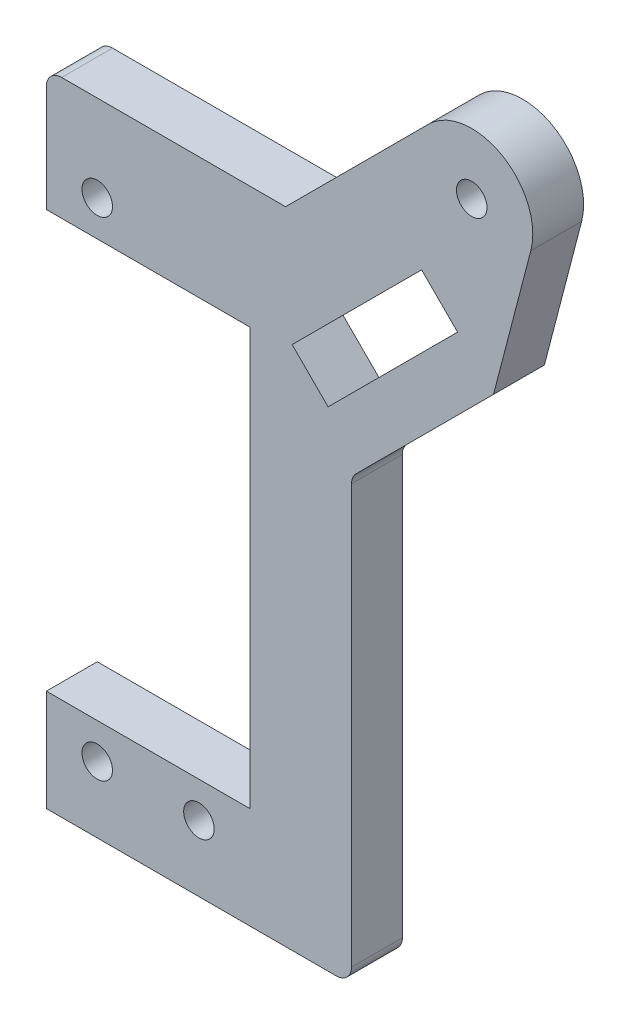
ISO-10303-21;
HEADER;
FILE_DESCRIPTION(('STEP AP214'),'2;1');
FILE_NAME('part.step','',(''),(''),'','','');
FILE_SCHEMA(('AUTOMOTIVE_DESIGN { 1 0 10303 214 1 1 1 1 }'));
ENDSEC;
DATA;
#1=APPLICATION_CONTEXT('core data for automotive mechanical design processes');
#2=APPLICATION_PROTOCOL_DEFINITION('international standard','automotive_design',2000,#1);
#3=PRODUCT_CONTEXT('',#1,'mechanical');
#4=PRODUCT('Part','Part','',(#3));
#5=PRODUCT_RELATED_PRODUCT_CATEGORY('part','',(#4));
#6=PRODUCT_DEFINITION_FORMATION('','',#4);
#7=PRODUCT_DEFINITION_CONTEXT('part definition',#1,'design');
#8=PRODUCT_DEFINITION('design','',#6,#7);
#9=PRODUCT_DEFINITION_SHAPE('','',#8);
#10=(LENGTH_UNIT() NAMED_UNIT(*) SI_UNIT(.MILLI.,.METRE.));
#11=(NAMED_UNIT(*) PLANE_ANGLE_UNIT() SI_UNIT($,.RADIAN.));
#12=(NAMED_UNIT(*) SI_UNIT($,.STERADIAN.) SOLID_ANGLE_UNIT());
#13=UNCERTAINTY_MEASURE_WITH_UNIT(LENGTH_MEASURE(1.E-05),#10,'distance_accuracy_value','');
#14=(GEOMETRIC_REPRESENTATION_CONTEXT(3) GLOBAL_UNCERTAINTY_ASSIGNED_CONTEXT((#13)) GLOBAL_UNIT_ASSIGNED_CONTEXT((#10,
#11,#12)) REPRESENTATION_CONTEXT('',''));
#15=CARTESIAN_POINT('',(0.,0.,0.));
#16=DIRECTION('',(0.,0.,1.));
#17=DIRECTION('',(1.,0.,0.));
#18=AXIS2_PLACEMENT_3D('',#15,#16,#17);
#19=CARTESIAN_POINT('',(-10.1762942811366,10.1762942811367,5.));
#20=DIRECTION('',(-0.707106781186545,0.70710678118655,0.));
#21=DIRECTION('',(-0.70710678118655,-0.707106781186545,0.));
#22=AXIS2_PLACEMENT_3D('',#19,#20,#21);
#23=PLANE('',#22);
#24=DIRECTION('',(0.70710678118655,0.707106781186545,0.));
#25=VECTOR('',#24,1.);
#26=CARTESIAN_POINT('',(-10.1762942811366,10.1762942811367,0.));
#27=LINE('',#26,#25);
#28=CARTESIAN_POINT('',(27.6980743896277,48.0506629519008,0.));
#29=VERTEX_POINT('',#28);
#30=CARTESIAN_POINT('',(40.4259964509856,60.7785850132586,0.));
#31=VERTEX_POINT('',#30);
#32=EDGE_CURVE('E274',#29,#31,#27,.T.);
#33=ORIENTED_EDGE('',*,*,#32,.F.);
#34=DIRECTION('',(0.,0.,-1.));
#35=VECTOR('',#34,1.);
#36=CARTESIAN_POINT('',(27.6980743896277,48.0506629519008,5.));
#37=LINE('',#36,#35);
#38=CARTESIAN_POINT('',(27.6980743896277,48.0506629519008,5.));
#39=VERTEX_POINT('',#38);
#40=EDGE_CURVE('E296',#39,#29,#37,.T.);
#41=ORIENTED_EDGE('',*,*,#40,.F.);
#42=DIRECTION('',(0.70710678118655,0.707106781186545,0.));
#43=VECTOR('',#42,1.);
#44=CARTESIAN_POINT('',(-10.1762942811366,10.1762942811367,5.));
#45=LINE('',#44,#43);
#46=CARTESIAN_POINT('',(40.4259964509856,60.7785850132586,5.));
#47=VERTEX_POINT('',#46);
#48=EDGE_CURVE('E221',#39,#47,#45,.T.);
#49=ORIENTED_EDGE('',*,*,#48,.T.);
#50=DIRECTION('',(0.,0.,-1.));
#51=VECTOR('',#50,1.);
#52=CARTESIAN_POINT('',(40.4259964509856,60.7785850132586,5.));
#53=LINE('',#52,#51);
#54=EDGE_CURVE('E177',#47,#31,#53,.T.);
#55=ORIENTED_EDGE('',*,*,#54,.T.);
#56=EDGE_LOOP('',(#33,#41,#49,#55));
#57=FACE_BOUND('',#56,.T.);
#58=ADVANCED_FACE('F35',(#57),#23,.T.);
#59=CARTESIAN_POINT('',(37.8743686707644,37.874368670764,5.));
#60=DIRECTION('',(0.707106781186551,0.707106781186544,0.));
#61=DIRECTION('',(-0.707106781186544,0.707106781186551,0.));
#62=AXIS2_PLACEMENT_3D('',#59,#60,#61);
#63=PLANE('',#62);
#64=DIRECTION('',(0.707106781186544,-0.707106781186551,0.));
#65=VECTOR('',#64,1.);
#66=CARTESIAN_POINT('',(37.8743686707644,37.874368670764,0.));
#67=LINE('',#66,#65);
#68=CARTESIAN_POINT('',(24.162540483695,51.5861968578336,0.));
#69=VERTEX_POINT('',#68);
#70=EDGE_CURVE('E277',#69,#29,#67,.T.);
#71=ORIENTED_EDGE('',*,*,#70,.F.);
#72=DIRECTION('',(0.,0.,-1.));
#73=VECTOR('',#72,1.);
#74=CARTESIAN_POINT('',(24.162540483695,51.5861968578336,5.));
#75=LINE('',#74,#73);
#76=CARTESIAN_POINT('',(24.162540483695,51.5861968578336,5.));
#77=VERTEX_POINT('',#76);
#78=EDGE_CURVE('E294',#77,#69,#75,.T.);
#79=ORIENTED_EDGE('',*,*,#78,.F.);
#80=DIRECTION('',(0.707106781186544,-0.707106781186551,0.));
#81=VECTOR('',#80,1.);
#82=CARTESIAN_POINT('',(37.8743686707644,37.874368670764,5.));
#83=LINE('',#82,#81);
#84=EDGE_CURVE('E224',#77,#39,#83,.T.);
#85=ORIENTED_EDGE('',*,*,#84,.T.);
#86=ORIENTED_EDGE('',*,*,#40,.T.);
#87=EDGE_LOOP('',(#71,#79,#85,#86));
#88=FACE_BOUND('',#87,.T.);
#89=ADVANCED_FACE('F397',(#88),#63,.T.);
#90=CARTESIAN_POINT('',(-13.7118281870694,13.7118281870695,5.));
#91=DIRECTION('',(0.707106781186545,-0.70710678118655,0.));
#92=DIRECTION('',(0.70710678118655,0.707106781186545,0.));
#93=AXIS2_PLACEMENT_3D('',#90,#91,#92);
#94=PLANE('',#93);
#95=DIRECTION('',(-0.70710678118655,-0.707106781186545,0.));
#96=VECTOR('',#95,1.);
#97=CARTESIAN_POINT('',(-13.7118281870694,13.7118281870695,0.));
#98=LINE('',#97,#96);
#99=CARTESIAN_POINT('',(36.8904625450529,64.3141189191914,0.));
#100=VERTEX_POINT('',#99);
#101=EDGE_CURVE('E280',#100,#69,#98,.T.);
#102=ORIENTED_EDGE('',*,*,#101,.F.);
#103=DIRECTION('',(0.,0.,-1.));
#104=VECTOR('',#103,1.);
#105=CARTESIAN_POINT('',(36.8904625450529,64.3141189191914,5.));
#106=LINE('',#105,#104);
#107=CARTESIAN_POINT('',(36.8904625450529,64.3141189191914,5.));
#108=VERTEX_POINT('',#107);
#109=EDGE_CURVE('E292',#108,#100,#106,.T.);
#110=ORIENTED_EDGE('',*,*,#109,.F.);
#111=DIRECTION('',(-0.70710678118655,-0.707106781186545,0.));
#112=VECTOR('',#111,1.);
#113=CARTESIAN_POINT('',(-13.7118281870694,13.7118281870695,5.));
#114=LINE('',#113,#112);
#115=EDGE_CURVE('E227',#108,#77,#114,.T.);
#116=ORIENTED_EDGE('',*,*,#115,.T.);
#117=ORIENTED_EDGE('',*,*,#78,.T.);
#118=EDGE_LOOP('',(#102,#110,#116,#117));
#119=FACE_BOUND('',#118,.T.);
#120=ADVANCED_FACE('F403',(#119),#94,.T.);
#121=CARTESIAN_POINT('',(41.8198051533549,72.8198051533756,5.));
#122=DIRECTION('',(0.,0.,-1.));
#123=DIRECTION('',(-1.,0.,0.));
#124=AXIS2_PLACEMENT_3D('',#121,#122,#123);
#125=CYLINDRICAL_SURFACE('',#124,5.99999999999999);
#126=CARTESIAN_POINT('',(41.8198051533549,72.8198051533756,0.));
#127=DIRECTION('',(0.,0.,1.));
#128=DIRECTION('',(1.,0.,0.));
#129=AXIS2_PLACEMENT_3D('',#126,#127,#128);
#130=CIRCLE('',#129,5.99999999999999);
#131=CARTESIAN_POINT('',(37.5771644662356,77.0624458404949,0.));
#132=VERTEX_POINT('',#131);
#133=CARTESIAN_POINT('',(47.625955008488,71.3069853162047,0.));
#134=VERTEX_POINT('',#133);
#135=EDGE_CURVE('E173',#132,#134,#130,.F.);
#136=ORIENTED_EDGE('',*,*,#135,.F.);
#137=DIRECTION('',(0.,0.,-1.));
#138=VECTOR('',#137,1.);
#139=CARTESIAN_POINT('',(37.5771644662356,77.0624458404949,5.));
#140=LINE('',#139,#138);
#141=CARTESIAN_POINT('',(37.5771644662356,77.0624458404949,5.));
#142=VERTEX_POINT('',#141);
#143=EDGE_CURVE('E166',#142,#132,#140,.T.);
#144=ORIENTED_EDGE('',*,*,#143,.F.);
#145=CARTESIAN_POINT('',(41.8198051533549,72.8198051533756,5.));
#146=DIRECTION('',(0.,0.,1.));
#147=DIRECTION('',(1.,0.,0.));
#148=AXIS2_PLACEMENT_3D('',#145,#146,#147);
#149=CIRCLE('',#148,5.99999999999999);
#150=CARTESIAN_POINT('',(47.625955008488,71.3069853162047,5.));
#151=VERTEX_POINT('',#150);
#152=EDGE_CURVE('E170',#142,#151,#149,.F.);
#153=ORIENTED_EDGE('',*,*,#152,.T.);
#154=DIRECTION('',(0.,0.,-1.));
#155=VECTOR('',#154,1.);
#156=CARTESIAN_POINT('',(47.625955008488,71.3069853162047,5.));
#157=LINE('',#156,#155);
#158=EDGE_CURVE('E241',#151,#134,#157,.T.);
#159=ORIENTED_EDGE('',*,*,#158,.T.);
#160=EDGE_LOOP('',(#136,#144,#153,#159));
#161=FACE_BOUND('',#160,.T.);
#162=ADVANCED_FACE('F168',(#161),#125,.T.);
#163=CARTESIAN_POINT('',(-19.7426406871298,19.7426406871299,5.));
#164=DIRECTION('',(0.707106781186545,-0.70710678118655,0.));
#165=DIRECTION('',(0.70710678118655,0.707106781186545,0.));
#166=AXIS2_PLACEMENT_3D('',#163,#164,#165);
#167=PLANE('',#166);
#168=DIRECTION('',(-0.70710678118655,-0.707106781186545,0.));
#169=VECTOR('',#168,1.);
#170=CARTESIAN_POINT('',(-19.7426406871298,19.7426406871299,0.));
#171=LINE('',#170,#169);
#172=CARTESIAN_POINT('',(23.5147186257407,63.,0.));
#173=VERTEX_POINT('',#172);
#174=EDGE_CURVE('E243',#132,#173,#171,.T.);
#175=ORIENTED_EDGE('',*,*,#174,.T.);
#176=DIRECTION('',(0.,0.,-1.));
#177=VECTOR('',#176,1.);
#178=CARTESIAN_POINT('',(23.5147186257407,63.,5.));
#179=LINE('',#178,#177);
#180=CARTESIAN_POINT('',(23.5147186257407,63.,5.));
#181=VERTEX_POINT('',#180);
#182=EDGE_CURVE('E178',#181,#173,#179,.T.);
#183=ORIENTED_EDGE('',*,*,#182,.F.);
#184=DIRECTION('',(-0.70710678118655,-0.707106781186545,0.));
#185=VECTOR('',#184,1.);
#186=CARTESIAN_POINT('',(-19.7426406871298,19.7426406871299,5.));
#187=LINE('',#186,#185);
#188=EDGE_CURVE('E182',#142,#181,#187,.T.);
#189=ORIENTED_EDGE('',*,*,#188,.F.);
#190=ORIENTED_EDGE('',*,*,#143,.T.);
#191=EDGE_LOOP('',(#175,#183,#189,#190));
#192=FACE_BOUND('',#191,.T.);
#193=ADVANCED_FACE('F183',(#192),#167,.F.);
#194=CARTESIAN_POINT('',(0.,63.,5.));
#195=DIRECTION('',(0.,1.,0.));
#196=DIRECTION('',(-1.,0.,0.));
#197=AXIS2_PLACEMENT_3D('',#194,#195,#196);
#198=PLANE('',#197);
#199=DIRECTION('',(1.,0.,0.));
#200=VECTOR('',#199,1.);
#201=CARTESIAN_POINT('',(0.,63.,0.));
#202=LINE('',#201,#200);
#203=CARTESIAN_POINT('',(1.49999999999995,63.,0.));
#204=VERTEX_POINT('',#203);
#205=EDGE_CURVE('E245',#204,#173,#202,.T.);
#206=ORIENTED_EDGE('',*,*,#205,.F.);
#207=DIRECTION('',(0.,0.,-1.));
#208=VECTOR('',#207,1.);
#209=CARTESIAN_POINT('',(1.49999999999995,63.,5.));
#210=LINE('',#209,#208);
#211=CARTESIAN_POINT('',(1.49999999999995,63.,5.));
#212=VERTEX_POINT('',#211);
#213=EDGE_CURVE('E322',#204,#212,#210,.F.);
#214=ORIENTED_EDGE('',*,*,#213,.T.);
#215=DIRECTION('',(1.,0.,0.));
#216=VECTOR('',#215,1.);
#217=CARTESIAN_POINT('',(0.,63.,5.));
#218=LINE('',#217,#216);
#219=EDGE_CURVE('E186',#212,#181,#218,.T.);
#220=ORIENTED_EDGE('',*,*,#219,.T.);
#221=ORIENTED_EDGE('',*,*,#182,.T.);
#222=EDGE_LOOP('',(#206,#214,#220,#221));
#223=FACE_BOUND('',#222,.T.);
#224=ADVANCED_FACE('F356',(#223),#198,.T.);
#225=CARTESIAN_POINT('',(0.,0.,5.));
#226=DIRECTION('',(1.,0.,0.));
#227=DIRECTION('',(0.,1.,0.));
#228=AXIS2_PLACEMENT_3D('',#225,#226,#227);
#229=PLANE('',#228);
#230=DIRECTION('',(0.,-1.,0.));
#231=VECTOR('',#230,1.);
#232=CARTESIAN_POINT('',(0.,0.,5.));
#233=LINE('',#232,#231);
#234=CARTESIAN_POINT('',(0.,61.5,5.));
#235=VERTEX_POINT('',#234);
#236=CARTESIAN_POINT('',(0.,51.,5.));
#237=VERTEX_POINT('',#236);
#238=EDGE_CURVE('E199',#235,#237,#233,.T.);
#239=ORIENTED_EDGE('',*,*,#238,.F.);
#240=DIRECTION('',(0.,0.,-1.));
#241=VECTOR('',#240,1.);
#242=CARTESIAN_POINT('',(0.,61.5,0.));
#243=LINE('',#242,#241);
#244=CARTESIAN_POINT('',(0.,61.5,0.));
#245=VERTEX_POINT('',#244);
#246=EDGE_CURVE('E298',#235,#245,#243,.T.);
#247=ORIENTED_EDGE('',*,*,#246,.T.);
#248=DIRECTION('',(0.,-1.,0.));
#249=VECTOR('',#248,1.);
#250=CARTESIAN_POINT('',(0.,0.,0.));
#251=LINE('',#250,#249);
#252=CARTESIAN_POINT('',(0.,51.,0.));
#253=VERTEX_POINT('',#252);
#254=EDGE_CURVE('E247',#245,#253,#251,.T.);
#255=ORIENTED_EDGE('',*,*,#254,.T.);
#256=DIRECTION('',(0.,0.,-1.));
#257=VECTOR('',#256,1.);
#258=CARTESIAN_POINT('',(0.,51.,5.));
#259=LINE('',#258,#257);
#260=EDGE_CURVE('E312',#237,#253,#259,.T.);
#261=ORIENTED_EDGE('',*,*,#260,.F.);
#262=EDGE_LOOP('',(#239,#247,#255,#261));
#263=FACE_BOUND('',#262,.T.);
#264=ADVANCED_FACE('F363',(#263),#229,.F.);
#265=CARTESIAN_POINT('',(0.,51.,5.));
#266=DIRECTION('',(0.,-1.,0.));
#267=DIRECTION('',(0.,0.,-1.));
#268=AXIS2_PLACEMENT_3D('',#265,#266,#267);
#269=PLANE('',#268);
#270=DIRECTION('',(-1.,0.,0.));
#271=VECTOR('',#270,1.);
#272=CARTESIAN_POINT('',(0.,51.,0.));
#273=LINE('',#272,#271);
#274=CARTESIAN_POINT('',(20.,51.,0.));
#275=VERTEX_POINT('',#274);
#276=EDGE_CURVE('E249',#275,#253,#273,.T.);
#277=ORIENTED_EDGE('',*,*,#276,.F.);
#278=DIRECTION('',(0.,0.,-1.));
#279=VECTOR('',#278,1.);
#280=CARTESIAN_POINT('',(20.,51.,5.));
#281=LINE('',#280,#279);
#282=CARTESIAN_POINT('',(20.,51.,5.));
#283=VERTEX_POINT('',#282);
#284=EDGE_CURVE('E310',#283,#275,#281,.T.);
#285=ORIENTED_EDGE('',*,*,#284,.F.);
#286=DIRECTION('',(-1.,0.,0.));
#287=VECTOR('',#286,1.);
#288=CARTESIAN_POINT('',(0.,51.,5.));
#289=LINE('',#288,#287);
#290=EDGE_CURVE('E201',#283,#237,#289,.T.);
#291=ORIENTED_EDGE('',*,*,#290,.T.);
#292=ORIENTED_EDGE('',*,*,#260,.T.);
#293=EDGE_LOOP('',(#277,#285,#291,#292));
#294=FACE_BOUND('',#293,.T.);
#295=ADVANCED_FACE('F369',(#294),#269,.T.);
#296=CARTESIAN_POINT('',(19.9999999999999,0.,5.));
#297=DIRECTION('',(-1.,0.,0.));
#298=DIRECTION('',(0.,-1.,0.));
#299=AXIS2_PLACEMENT_3D('',#296,#297,#298);
#300=PLANE('',#299);
#301=DIRECTION('',(0.,1.,0.));
#302=VECTOR('',#301,1.);
#303=CARTESIAN_POINT('',(19.9999999999999,0.,0.));
#304=LINE('',#303,#302);
#305=CARTESIAN_POINT('',(19.9999999999999,10.,0.));
#306=VERTEX_POINT('',#305);
#307=EDGE_CURVE('E252',#306,#275,#304,.T.);
#308=ORIENTED_EDGE('',*,*,#307,.F.);
#309=DIRECTION('',(0.,0.,-1.));
#310=VECTOR('',#309,1.);
#311=CARTESIAN_POINT('',(19.9999999999999,10.,5.));
#312=LINE('',#311,#310);
#313=CARTESIAN_POINT('',(19.9999999999999,10.,5.));
#314=VERTEX_POINT('',#313);
#315=EDGE_CURVE('E308',#314,#306,#312,.T.);
#316=ORIENTED_EDGE('',*,*,#315,.F.);
#317=DIRECTION('',(0.,1.,0.));
#318=VECTOR('',#317,1.);
#319=CARTESIAN_POINT('',(19.9999999999999,0.,5.));
#320=LINE('',#319,#318);
#321=EDGE_CURVE('E204',#314,#283,#320,.T.);
#322=ORIENTED_EDGE('',*,*,#321,.T.);
#323=ORIENTED_EDGE('',*,*,#284,.T.);
#324=EDGE_LOOP('',(#308,#316,#322,#323));
#325=FACE_BOUND('',#324,.T.);
#326=ADVANCED_FACE('F373',(#325),#300,.T.);
#327=CARTESIAN_POINT('',(0.,10.,5.));
#328=DIRECTION('',(0.,-1.,0.));
#329=DIRECTION('',(1.,0.,0.));
#330=AXIS2_PLACEMENT_3D('',#327,#328,#329);
#331=PLANE('',#330);
#332=DIRECTION('',(-1.,0.,0.));
#333=VECTOR('',#332,1.);
#334=CARTESIAN_POINT('',(0.,10.,0.));
#335=LINE('',#334,#333);
#336=CARTESIAN_POINT('',(0.,10.,0.));
#337=VERTEX_POINT('',#336);
#338=EDGE_CURVE('E255',#306,#337,#335,.T.);
#339=ORIENTED_EDGE('',*,*,#338,.T.);
#340=DIRECTION('',(0.,0.,-1.));
#341=VECTOR('',#340,1.);
#342=CARTESIAN_POINT('',(0.,10.,5.));
#343=LINE('',#342,#341);
#344=CARTESIAN_POINT('',(0.,10.,5.));
#345=VERTEX_POINT('',#344);
#346=EDGE_CURVE('E305',#345,#337,#343,.T.);
#347=ORIENTED_EDGE('',*,*,#346,.F.);
#348=DIRECTION('',(-1.,0.,0.));
#349=VECTOR('',#348,1.);
#350=CARTESIAN_POINT('',(0.,10.,5.));
#351=LINE('',#350,#349);
#352=EDGE_CURVE('E207',#314,#345,#351,.T.);
#353=ORIENTED_EDGE('',*,*,#352,.F.);
#354=ORIENTED_EDGE('',*,*,#315,.T.);
#355=EDGE_LOOP('',(#339,#347,#353,#354));
#356=FACE_BOUND('',#355,.T.);
#357=ADVANCED_FACE('F377',(#356),#331,.F.);
#358=CARTESIAN_POINT('',(0.,0.,5.));
#359=DIRECTION('',(1.,0.,0.));
#360=DIRECTION('',(0.,1.,0.));
#361=AXIS2_PLACEMENT_3D('',#358,#359,#360);
#362=PLANE('',#361);
#363=DIRECTION('',(0.,-1.,0.));
#364=VECTOR('',#363,1.);
#365=CARTESIAN_POINT('',(0.,0.,0.));
#366=LINE('',#365,#364);
#367=CARTESIAN_POINT('',(0.,0.,0.));
#368=VERTEX_POINT('',#367);
#369=EDGE_CURVE('E257',#337,#368,#366,.T.);
#370=ORIENTED_EDGE('',*,*,#369,.T.);
#371=DIRECTION('',(0.,0.,-1.));
#372=VECTOR('',#371,1.);
#373=CARTESIAN_POINT('',(0.,0.,5.));
#374=LINE('',#373,#372);
#375=CARTESIAN_POINT('',(0.,0.,5.));
#376=VERTEX_POINT('',#375);
#377=EDGE_CURVE('E302',#376,#368,#374,.T.);
#378=ORIENTED_EDGE('',*,*,#377,.F.);
#379=DIRECTION('',(0.,-1.,0.));
#380=VECTOR('',#379,1.);
#381=CARTESIAN_POINT('',(0.,0.,5.));
#382=LINE('',#381,#380);
#383=EDGE_CURVE('E209',#345,#376,#382,.T.);
#384=ORIENTED_EDGE('',*,*,#383,.F.);
#385=ORIENTED_EDGE('',*,*,#346,.T.);
#386=EDGE_LOOP('',(#370,#378,#384,#385));
#387=FACE_BOUND('',#386,.T.);
#388=ADVANCED_FACE('F382',(#387),#362,.F.);
#389=CARTESIAN_POINT('',(0.,0.,5.));
#390=DIRECTION('',(0.,1.,0.));
#391=DIRECTION('',(-1.,0.,0.));
#392=AXIS2_PLACEMENT_3D('',#389,#390,#391);
#393=PLANE('',#392);
#394=DIRECTION('',(1.,0.,0.));
#395=VECTOR('',#394,1.);
#396=CARTESIAN_POINT('',(0.,0.,0.));
#397=LINE('',#396,#395);
#398=CARTESIAN_POINT('',(28.5,0.,0.));
#399=VERTEX_POINT('',#398);
#400=EDGE_CURVE('E259',#368,#399,#397,.T.);
#401=ORIENTED_EDGE('',*,*,#400,.T.);
#402=DIRECTION('',(0.,0.,-1.));
#403=VECTOR('',#402,1.);
#404=CARTESIAN_POINT('',(28.5,0.,5.));
#405=LINE('',#404,#403);
#406=CARTESIAN_POINT('',(28.5,0.,5.));
#407=VERTEX_POINT('',#406);
#408=EDGE_CURVE('E332',#399,#407,#405,.F.);
#409=ORIENTED_EDGE('',*,*,#408,.T.);
#410=DIRECTION('',(1.,0.,0.));
#411=VECTOR('',#410,1.);
#412=CARTESIAN_POINT('',(0.,0.,5.));
#413=LINE('',#412,#411);
#414=EDGE_CURVE('E211',#376,#407,#413,.T.);
#415=ORIENTED_EDGE('',*,*,#414,.F.);
#416=ORIENTED_EDGE('',*,*,#377,.T.);
#417=EDGE_LOOP('',(#401,#409,#415,#416));
#418=FACE_BOUND('',#417,.T.);
#419=ADVANCED_FACE('F386',(#418),#393,.F.);
#420=CARTESIAN_POINT('',(30.,0.,5.));
#421=DIRECTION('',(1.,0.,0.));
#422=DIRECTION('',(0.,1.,0.));
#423=AXIS2_PLACEMENT_3D('',#420,#421,#422);
#424=PLANE('',#423);
#425=DIRECTION('',(0.,-1.,0.));
#426=VECTOR('',#425,1.);
#427=CARTESIAN_POINT('',(30.,0.,5.));
#428=LINE('',#427,#426);
#429=CARTESIAN_POINT('',(29.9999999999999,42.6602004068479,5.));
#430=VERTEX_POINT('',#429);
#431=CARTESIAN_POINT('',(30.,1.49999999999999,5.));
#432=VERTEX_POINT('',#431);
#433=EDGE_CURVE('E213',#430,#432,#428,.T.);
#434=ORIENTED_EDGE('',*,*,#433,.T.);
#435=DIRECTION('',(0.,0.,-1.));
#436=VECTOR('',#435,1.);
#437=CARTESIAN_POINT('',(30.,1.49999999999999,0.));
#438=LINE('',#437,#436);
#439=CARTESIAN_POINT('',(30.,1.49999999999999,0.));
#440=VERTEX_POINT('',#439);
#441=EDGE_CURVE('E329',#432,#440,#438,.T.);
#442=ORIENTED_EDGE('',*,*,#441,.T.);
#443=DIRECTION('',(0.,-1.,0.));
#444=VECTOR('',#443,1.);
#445=CARTESIAN_POINT('',(30.,0.,0.));
#446=LINE('',#445,#444);
#447=CARTESIAN_POINT('',(29.9999999999999,42.6602004068479,0.));
#448=VERTEX_POINT('',#447);
#449=EDGE_CURVE('E262',#448,#440,#446,.T.);
#450=ORIENTED_EDGE('',*,*,#449,.F.);
#451=DIRECTION('',(0.,0.,-1.));
#452=VECTOR('',#451,1.);
#453=CARTESIAN_POINT('',(29.9999999999999,42.6602004068479,5.));
#454=LINE('',#453,#452);
#455=EDGE_CURVE('E327',#448,#430,#454,.F.);
#456=ORIENTED_EDGE('',*,*,#455,.T.);
#457=EDGE_LOOP('',(#434,#442,#450,#456));
#458=FACE_BOUND('',#457,.T.);
#459=ADVANCED_FACE('F346',(#458),#424,.T.);
#460=CARTESIAN_POINT('',(-6.64076037520394,6.64076037520399,5.));
#461=DIRECTION('',(0.707106781186545,-0.70710678118655,0.));
#462=DIRECTION('',(0.70710678118655,0.707106781186545,0.));
#463=AXIS2_PLACEMENT_3D('',#460,#461,#462);
#464=PLANE('',#463);
#465=DIRECTION('',(-0.70710678118655,-0.707106781186545,0.));
#466=VECTOR('',#465,1.);
#467=CARTESIAN_POINT('',(-6.64076037520394,6.64076037520399,5.));
#468=LINE('',#467,#466);
#469=CARTESIAN_POINT('',(43.9615303569183,57.2430511073259,5.));
#470=VERTEX_POINT('',#469);
#471=CARTESIAN_POINT('',(30.4393398282201,43.7208605786277,5.));
#472=VERTEX_POINT('',#471);
#473=EDGE_CURVE('E215',#470,#472,#468,.T.);
#474=ORIENTED_EDGE('',*,*,#473,.T.);
#475=DIRECTION('',(0.,0.,-1.));
#476=VECTOR('',#475,1.);
#477=CARTESIAN_POINT('',(30.4393398282201,43.7208605786277,0.));
#478=LINE('',#477,#476);
#479=CARTESIAN_POINT('',(30.4393398282201,43.7208605786277,0.));
#480=VERTEX_POINT('',#479);
#481=EDGE_CURVE('E334',#472,#480,#478,.T.);
#482=ORIENTED_EDGE('',*,*,#481,.T.);
#483=DIRECTION('',(-0.70710678118655,-0.707106781186545,0.));
#484=VECTOR('',#483,1.);
#485=CARTESIAN_POINT('',(-6.64076037520394,6.64076037520399,0.));
#486=LINE('',#485,#484);
#487=CARTESIAN_POINT('',(43.9615303569183,57.2430511073259,0.));
#488=VERTEX_POINT('',#487);
#489=EDGE_CURVE('E265',#488,#480,#486,.T.);
#490=ORIENTED_EDGE('',*,*,#489,.F.);
#491=DIRECTION('',(0.,0.,-1.));
#492=VECTOR('',#491,1.);
#493=CARTESIAN_POINT('',(43.9615303569183,57.2430511073259,5.));
#494=LINE('',#493,#492);
#495=EDGE_CURVE('E300',#470,#488,#494,.T.);
#496=ORIENTED_EDGE('',*,*,#495,.F.);
#497=EDGE_LOOP('',(#474,#482,#490,#496));
#498=FACE_BOUND('',#497,.T.);
#499=ADVANCED_FACE('F349',(#498),#464,.T.);
#500=CARTESIAN_POINT('',(15.,6.50000000000002,5.));
#501=DIRECTION('',(0.,0.,-1.));
#502=DIRECTION('',(-1.,0.,0.));
#503=AXIS2_PLACEMENT_3D('',#500,#501,#502);
#504=CYLINDRICAL_SURFACE('',#503,1.5);
#505=CARTESIAN_POINT('',(15.,6.50000000000002,5.));
#506=DIRECTION('',(0.,0.,1.));
#507=DIRECTION('',(1.,0.,0.));
#508=AXIS2_PLACEMENT_3D('',#505,#506,#507);
#509=CIRCLE('',#508,1.5);
#510=CARTESIAN_POINT('',(16.5,6.50000000000002,5.));
#511=VERTEX_POINT('',#510);
#512=EDGE_CURVE('E235',#511,#511,#509,.T.);
#513=ORIENTED_EDGE('',*,*,#512,.T.);
#514=EDGE_LOOP('',(#513));
#515=FACE_BOUND('',#514,.T.);
#516=CARTESIAN_POINT('',(15.,6.50000000000002,0.));
#517=DIRECTION('',(0.,0.,1.));
#518=DIRECTION('',(1.,0.,0.));
#519=AXIS2_PLACEMENT_3D('',#516,#517,#518);
#520=CIRCLE('',#519,1.5);
#521=CARTESIAN_POINT('',(16.5,6.50000000000002,0.));
#522=VERTEX_POINT('',#521);
#523=EDGE_CURVE('E195',#522,#522,#520,.T.);
#524=ORIENTED_EDGE('',*,*,#523,.F.);
#525=EDGE_LOOP('',(#524));
#526=FACE_BOUND('',#525,.T.);
#527=ADVANCED_FACE('F419',(#515,#526),#504,.F.);
#528=CARTESIAN_POINT('',(4.99999999999995,54.5,5.));
#529=DIRECTION('',(0.,0.,-1.));
#530=DIRECTION('',(-1.,0.,0.));
#531=AXIS2_PLACEMENT_3D('',#528,#529,#530);
#532=CYLINDRICAL_SURFACE('',#531,1.5);
#533=CARTESIAN_POINT('',(4.99999999999995,54.5,5.));
#534=DIRECTION('',(0.,0.,1.));
#535=DIRECTION('',(1.,0.,0.));
#536=AXIS2_PLACEMENT_3D('',#533,#534,#535);
#537=CIRCLE('',#536,1.5);
#538=CARTESIAN_POINT('',(6.49999999999995,54.5,5.));
#539=VERTEX_POINT('',#538);
#540=EDGE_CURVE('E232',#539,#539,#537,.T.);
#541=ORIENTED_EDGE('',*,*,#540,.T.);
#542=EDGE_LOOP('',(#541));
#543=FACE_BOUND('',#542,.T.);
#544=CARTESIAN_POINT('',(4.99999999999995,54.5,0.));
#545=DIRECTION('',(0.,0.,1.));
#546=DIRECTION('',(1.,0.,0.));
#547=AXIS2_PLACEMENT_3D('',#544,#545,#546);
#548=CIRCLE('',#547,1.5);
#549=CARTESIAN_POINT('',(6.49999999999995,54.5,0.));
#550=VERTEX_POINT('',#549);
#551=EDGE_CURVE('E286',#550,#550,#548,.T.);
#552=ORIENTED_EDGE('',*,*,#551,.F.);
#553=EDGE_LOOP('',(#552));
#554=FACE_BOUND('',#553,.T.);
#555=ADVANCED_FACE('F449',(#543,#554),#532,.F.);
#556=CARTESIAN_POINT('',(50.6022907321223,50.6022907321219,5.));
#557=DIRECTION('',(0.70710678118655,0.707106781186545,0.));
#558=DIRECTION('',(-0.707106781186545,0.70710678118655,0.));
#559=AXIS2_PLACEMENT_3D('',#556,#557,#558);
#560=PLANE('',#559);
#561=DIRECTION('',(0.707106781186545,-0.70710678118655,0.));
#562=VECTOR('',#561,1.);
#563=CARTESIAN_POINT('',(50.6022907321223,50.6022907321219,0.));
#564=LINE('',#563,#562);
#565=EDGE_CURVE('E283',#100,#31,#564,.T.);
#566=ORIENTED_EDGE('',*,*,#565,.T.);
#567=ORIENTED_EDGE('',*,*,#54,.F.);
#568=DIRECTION('',(0.707106781186545,-0.70710678118655,0.));
#569=VECTOR('',#568,1.);
#570=CARTESIAN_POINT('',(50.6022907321223,50.6022907321219,5.));
#571=LINE('',#570,#569);
#572=EDGE_CURVE('E230',#108,#47,#571,.T.);
#573=ORIENTED_EDGE('',*,*,#572,.F.);
#574=ORIENTED_EDGE('',*,*,#109,.T.);
#575=EDGE_LOOP('',(#566,#567,#573,#574));
#576=FACE_BOUND('',#575,.T.);
#577=ADVANCED_FACE('F412',(#576),#560,.F.);
#578=CARTESIAN_POINT('',(41.8198051533549,72.8198051533756,5.));
#579=DIRECTION('',(0.,0.,-1.));
#580=DIRECTION('',(-1.,0.,0.));
#581=AXIS2_PLACEMENT_3D('',#578,#579,#580);
#582=CYLINDRICAL_SURFACE('',#581,1.49999999994865);
#583=CARTESIAN_POINT('',(41.8198051533549,72.8198051533756,5.));
#584=DIRECTION('',(0.,0.,1.));
#585=DIRECTION('',(1.,0.,0.));
#586=AXIS2_PLACEMENT_3D('',#583,#584,#585);
#587=CIRCLE('',#586,1.49999999994865);
#588=CARTESIAN_POINT('',(43.3198051533036,72.8198051533756,5.));
#589=VERTEX_POINT('',#588);
#590=EDGE_CURVE('E218',#589,#589,#587,.T.);
#591=ORIENTED_EDGE('',*,*,#590,.T.);
#592=EDGE_LOOP('',(#591));
#593=FACE_BOUND('',#592,.T.);
#594=CARTESIAN_POINT('',(41.8198051533549,72.8198051533756,0.));
#595=DIRECTION('',(0.,0.,1.));
#596=DIRECTION('',(1.,0.,0.));
#597=AXIS2_PLACEMENT_3D('',#594,#595,#596);
#598=CIRCLE('',#597,1.49999999994865);
#599=CARTESIAN_POINT('',(43.3198051533036,72.8198051533756,0.));
#600=VERTEX_POINT('',#599);
#601=EDGE_CURVE('E271',#600,#600,#598,.T.);
#602=ORIENTED_EDGE('',*,*,#601,.F.);
#603=EDGE_LOOP('',(#602));
#604=FACE_BOUND('',#603,.T.);
#605=ADVANCED_FACE('F409',(#593,#604),#582,.F.);
#606=CARTESIAN_POINT('',(27.200007303468,-7.08709069634145,5.));
#607=DIRECTION('',(0.967691642522187,-0.252136639528474,0.));
#608=DIRECTION('',(0.252136639528474,0.967691642522187,0.));
#609=AXIS2_PLACEMENT_3D('',#606,#607,#608);
#610=PLANE('',#609);
#611=DIRECTION('',(-0.252136639528474,-0.967691642522187,0.));
#612=VECTOR('',#611,1.);
#613=CARTESIAN_POINT('',(27.200007303468,-7.08709069634145,0.));
#614=LINE('',#613,#612);
#615=EDGE_CURVE('E268',#134,#488,#614,.T.);
#616=ORIENTED_EDGE('',*,*,#615,.F.);
#617=ORIENTED_EDGE('',*,*,#158,.F.);
#618=DIRECTION('',(-0.252136639528474,-0.967691642522187,0.));
#619=VECTOR('',#618,1.);
#620=CARTESIAN_POINT('',(27.200007303468,-7.08709069634145,5.));
#621=LINE('',#620,#619);
#622=EDGE_CURVE('E191',#151,#470,#621,.T.);
#623=ORIENTED_EDGE('',*,*,#622,.T.);
#624=ORIENTED_EDGE('',*,*,#495,.T.);
#625=EDGE_LOOP('',(#616,#617,#623,#624));
#626=FACE_BOUND('',#625,.T.);
#627=ADVANCED_FACE('F352',(#626),#610,.T.);
#628=CARTESIAN_POINT('',(4.99999999999995,6.50000000000002,5.));
#629=DIRECTION('',(0.,0.,-1.));
#630=DIRECTION('',(-1.,0.,0.));
#631=AXIS2_PLACEMENT_3D('',#628,#629,#630);
#632=CYLINDRICAL_SURFACE('',#631,1.5);
#633=CARTESIAN_POINT('',(4.99999999999995,6.50000000000002,5.));
#634=DIRECTION('',(0.,0.,1.));
#635=DIRECTION('',(1.,0.,0.));
#636=AXIS2_PLACEMENT_3D('',#633,#634,#635);
#637=CIRCLE('',#636,1.5);
#638=CARTESIAN_POINT('',(6.49999999999995,6.50000000000002,5.));
#639=VERTEX_POINT('',#638);
#640=EDGE_CURVE('E238',#639,#639,#637,.F.);
#641=ORIENTED_EDGE('',*,*,#640,.F.);
#642=EDGE_LOOP('',(#641));
#643=FACE_BOUND('',#642,.T.);
#644=CARTESIAN_POINT('',(4.99999999999995,6.50000000000002,0.));
#645=DIRECTION('',(0.,0.,1.));
#646=DIRECTION('',(1.,0.,0.));
#647=AXIS2_PLACEMENT_3D('',#644,#645,#646);
#648=CIRCLE('',#647,1.5);
#649=CARTESIAN_POINT('',(6.49999999999995,6.50000000000002,0.));
#650=VERTEX_POINT('',#649);
#651=EDGE_CURVE('E192',#650,#650,#648,.F.);
#652=ORIENTED_EDGE('',*,*,#651,.T.);
#653=EDGE_LOOP('',(#652));
#654=FACE_BOUND('',#653,.T.);
#655=ADVANCED_FACE('F416',(#643,#654),#632,.F.);
#656=CARTESIAN_POINT('',(0.,0.,5.));
#657=DIRECTION('',(0.,0.,1.));
#658=DIRECTION('',(1.,0.,0.));
#659=AXIS2_PLACEMENT_3D('',#656,#657,#658);
#660=PLANE('',#659);
#661=ORIENTED_EDGE('',*,*,#219,.F.);
#662=CARTESIAN_POINT('',(1.49999999999995,61.5,5.));
#663=DIRECTION('',(0.,0.,1.));
#664=DIRECTION('',(1.,0.,0.));
#665=AXIS2_PLACEMENT_3D('',#662,#663,#664);
#666=CIRCLE('',#665,1.5);
#667=EDGE_CURVE('E325',#212,#235,#666,.T.);
#668=ORIENTED_EDGE('',*,*,#667,.T.);
#669=ORIENTED_EDGE('',*,*,#238,.T.);
#670=ORIENTED_EDGE('',*,*,#290,.F.);
#671=ORIENTED_EDGE('',*,*,#321,.F.);
#672=ORIENTED_EDGE('',*,*,#352,.T.);
#673=ORIENTED_EDGE('',*,*,#383,.T.);
#674=ORIENTED_EDGE('',*,*,#414,.T.);
#675=CARTESIAN_POINT('',(28.5,1.49999999999999,5.));
#676=DIRECTION('',(0.,0.,1.));
#677=DIRECTION('',(1.,0.,0.));
#678=AXIS2_PLACEMENT_3D('',#675,#676,#677);
#679=CIRCLE('',#678,1.5);
#680=EDGE_CURVE('E54',#407,#432,#679,.T.);
#681=ORIENTED_EDGE('',*,*,#680,.T.);
#682=ORIENTED_EDGE('',*,*,#433,.F.);
#683=CARTESIAN_POINT('',(31.4999999999999,42.6602004068479,5.));
#684=DIRECTION('',(0.,0.,1.));
#685=DIRECTION('',(1.,0.,0.));
#686=AXIS2_PLACEMENT_3D('',#683,#684,#685);
#687=CIRCLE('',#686,1.5);
#688=EDGE_CURVE('E11',#430,#472,#687,.F.);
#689=ORIENTED_EDGE('',*,*,#688,.T.);
#690=ORIENTED_EDGE('',*,*,#473,.F.);
#691=ORIENTED_EDGE('',*,*,#622,.F.);
#692=ORIENTED_EDGE('',*,*,#152,.F.);
#693=ORIENTED_EDGE('',*,*,#188,.T.);
#694=EDGE_LOOP('',(#661,#668,#669,#670,#671,#672,#673,#674,#681,#682,#689,#690,#691,#692,#693));
#695=FACE_BOUND('',#694,.T.);
#696=ORIENTED_EDGE('',*,*,#590,.F.);
#697=EDGE_LOOP('',(#696));
#698=FACE_BOUND('',#697,.T.);
#699=ORIENTED_EDGE('',*,*,#48,.F.);
#700=ORIENTED_EDGE('',*,*,#84,.F.);
#701=ORIENTED_EDGE('',*,*,#115,.F.);
#702=ORIENTED_EDGE('',*,*,#572,.T.);
#703=EDGE_LOOP('',(#699,#700,#701,#702));
#704=FACE_BOUND('',#703,.T.);
#705=ORIENTED_EDGE('',*,*,#540,.F.);
#706=EDGE_LOOP('',(#705));
#707=FACE_BOUND('',#706,.T.);
#708=ORIENTED_EDGE('',*,*,#512,.F.);
#709=EDGE_LOOP('',(#708));
#710=FACE_BOUND('',#709,.T.);
#711=ORIENTED_EDGE('',*,*,#640,.T.);
#712=EDGE_LOOP('',(#711));
#713=FACE_BOUND('',#712,.T.);
#714=ADVANCED_FACE('F188',(#695,#698,#704,#707,#710,#713),#660,.T.);
#715=CARTESIAN_POINT('',(0.,0.,0.));
#716=DIRECTION('',(0.,0.,1.));
#717=DIRECTION('',(1.,0.,0.));
#718=AXIS2_PLACEMENT_3D('',#715,#716,#717);
#719=PLANE('',#718);
#720=ORIENTED_EDGE('',*,*,#254,.F.);
#721=CARTESIAN_POINT('',(1.49999999999995,61.5,0.));
#722=DIRECTION('',(0.,0.,1.));
#723=DIRECTION('',(1.,0.,0.));
#724=AXIS2_PLACEMENT_3D('',#721,#722,#723);
#725=CIRCLE('',#724,1.5);
#726=EDGE_CURVE('E320',#245,#204,#725,.F.);
#727=ORIENTED_EDGE('',*,*,#726,.T.);
#728=ORIENTED_EDGE('',*,*,#205,.T.);
#729=ORIENTED_EDGE('',*,*,#174,.F.);
#730=ORIENTED_EDGE('',*,*,#135,.T.);
#731=ORIENTED_EDGE('',*,*,#615,.T.);
#732=ORIENTED_EDGE('',*,*,#489,.T.);
#733=CARTESIAN_POINT('',(31.4999999999999,42.6602004068479,0.));
#734=DIRECTION('',(0.,0.,1.));
#735=DIRECTION('',(1.,0.,0.));
#736=AXIS2_PLACEMENT_3D('',#733,#734,#735);
#737=CIRCLE('',#736,1.5);
#738=EDGE_CURVE('E43',#480,#448,#737,.T.);
#739=ORIENTED_EDGE('',*,*,#738,.T.);
#740=ORIENTED_EDGE('',*,*,#449,.T.);
#741=CARTESIAN_POINT('',(28.5,1.49999999999999,0.));
#742=DIRECTION('',(0.,0.,1.));
#743=DIRECTION('',(1.,0.,0.));
#744=AXIS2_PLACEMENT_3D('',#741,#742,#743);
#745=CIRCLE('',#744,1.5);
#746=EDGE_CURVE('E318',#440,#399,#745,.F.);
#747=ORIENTED_EDGE('',*,*,#746,.T.);
#748=ORIENTED_EDGE('',*,*,#400,.F.);
#749=ORIENTED_EDGE('',*,*,#369,.F.);
#750=ORIENTED_EDGE('',*,*,#338,.F.);
#751=ORIENTED_EDGE('',*,*,#307,.T.);
#752=ORIENTED_EDGE('',*,*,#276,.T.);
#753=EDGE_LOOP('',(#720,#727,#728,#729,#730,#731,#732,#739,#740,#747,#748,#749,#750,#751,#752));
#754=FACE_BOUND('',#753,.T.);
#755=ORIENTED_EDGE('',*,*,#601,.T.);
#756=EDGE_LOOP('',(#755));
#757=FACE_BOUND('',#756,.T.);
#758=ORIENTED_EDGE('',*,*,#32,.T.);
#759=ORIENTED_EDGE('',*,*,#565,.F.);
#760=ORIENTED_EDGE('',*,*,#101,.T.);
#761=ORIENTED_EDGE('',*,*,#70,.T.);
#762=EDGE_LOOP('',(#758,#759,#760,#761));
#763=FACE_BOUND('',#762,.T.);
#764=ORIENTED_EDGE('',*,*,#551,.T.);
#765=EDGE_LOOP('',(#764));
#766=FACE_BOUND('',#765,.T.);
#767=ORIENTED_EDGE('',*,*,#523,.T.);
#768=EDGE_LOOP('',(#767));
#769=FACE_BOUND('',#768,.T.);
#770=ORIENTED_EDGE('',*,*,#651,.F.);
#771=EDGE_LOOP('',(#770));
#772=FACE_BOUND('',#771,.T.);
#773=ADVANCED_FACE('F339',(#754,#757,#763,#766,#769,#772),#719,.F.);
#774=CARTESIAN_POINT('',(1.49999999999995,61.5,5.));
#775=DIRECTION('',(0.,0.,1.));
#776=DIRECTION('',(1.,0.,0.));
#777=AXIS2_PLACEMENT_3D('',#774,#775,#776);
#778=CYLINDRICAL_SURFACE('',#777,1.5);
#779=ORIENTED_EDGE('',*,*,#667,.F.);
#780=ORIENTED_EDGE('',*,*,#213,.F.);
#781=ORIENTED_EDGE('',*,*,#726,.F.);
#782=ORIENTED_EDGE('',*,*,#246,.F.);
#783=EDGE_LOOP('',(#779,#780,#781,#782));
#784=FACE_BOUND('',#783,.T.);
#785=ADVANCED_FACE('F361',(#784),#778,.T.);
#786=CARTESIAN_POINT('',(28.5,1.49999999999999,5.));
#787=DIRECTION('',(0.,0.,1.));
#788=DIRECTION('',(1.,0.,0.));
#789=AXIS2_PLACEMENT_3D('',#786,#787,#788);
#790=CYLINDRICAL_SURFACE('',#789,1.5);
#791=ORIENTED_EDGE('',*,*,#680,.F.);
#792=ORIENTED_EDGE('',*,*,#408,.F.);
#793=ORIENTED_EDGE('',*,*,#746,.F.);
#794=ORIENTED_EDGE('',*,*,#441,.F.);
#795=EDGE_LOOP('',(#791,#792,#793,#794));
#796=FACE_BOUND('',#795,.T.);
#797=ADVANCED_FACE('F389',(#796),#790,.T.);
#798=CARTESIAN_POINT('',(31.4999999999999,42.6602004068479,5.));
#799=DIRECTION('',(0.,0.,1.));
#800=DIRECTION('',(1.,0.,0.));
#801=AXIS2_PLACEMENT_3D('',#798,#799,#800);
#802=CYLINDRICAL_SURFACE('',#801,1.5);
#803=ORIENTED_EDGE('',*,*,#688,.F.);
#804=ORIENTED_EDGE('',*,*,#455,.F.);
#805=ORIENTED_EDGE('',*,*,#738,.F.);
#806=ORIENTED_EDGE('',*,*,#481,.F.);
#807=EDGE_LOOP('',(#803,#804,#805,#806));
#808=FACE_BOUND('',#807,.T.);
#809=ADVANCED_FACE('F37',(#808),#802,.F.);
#810=CLOSED_SHELL('',(#58,#89,#120,#162,#193,#224,#264,#295,#326,#357,#388,#419,#459,#499,#527,
#555,#577,#605,#627,#655,#714,#773,#785,#797,#809));
#811=MANIFOLD_SOLID_BREP('B2',#810);
#812=ADVANCED_BREP_SHAPE_REPRESENTATION('',(#18,#811),#14);
#813=SHAPE_DEFINITION_REPRESENTATION(#9,#812);
ENDSEC;
END-ISO-10303-21;
